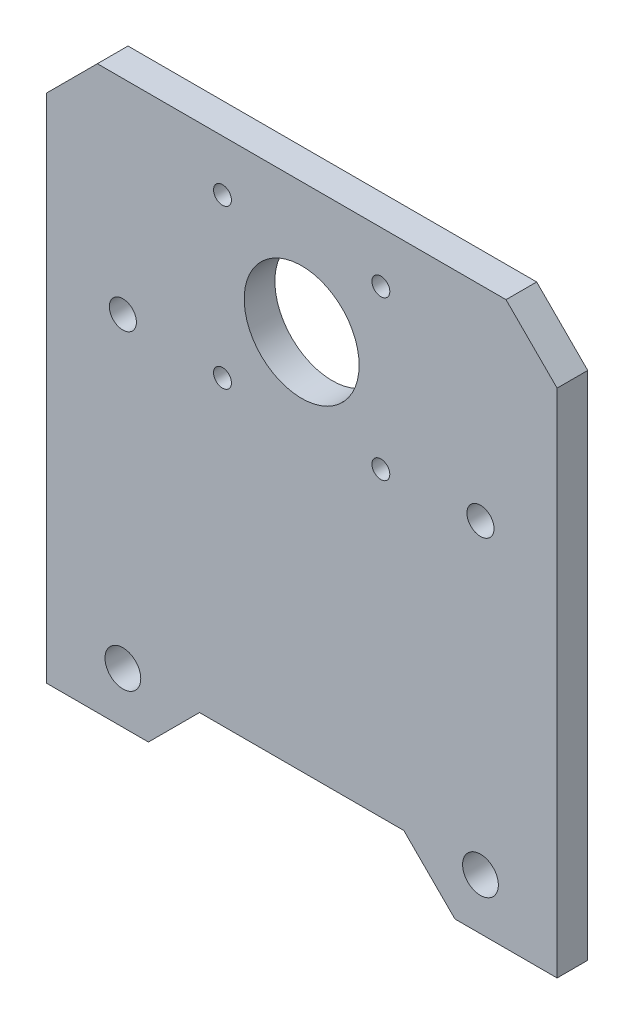
ISO-10303-21;
HEADER;
FILE_DESCRIPTION(('STEP AP214'),'2;1');
FILE_NAME('part.step','',(''),(''),'','','');
FILE_SCHEMA(('AUTOMOTIVE_DESIGN { 1 0 10303 214 1 1 1 1 }'));
ENDSEC;
DATA;
#1=APPLICATION_CONTEXT('core data for automotive mechanical design processes');
#2=APPLICATION_PROTOCOL_DEFINITION('international standard','automotive_design',2000,#1);
#3=PRODUCT_CONTEXT('',#1,'mechanical');
#4=PRODUCT('Part','Part','',(#3));
#5=PRODUCT_RELATED_PRODUCT_CATEGORY('part','',(#4));
#6=PRODUCT_DEFINITION_FORMATION('','',#4);
#7=PRODUCT_DEFINITION_CONTEXT('part definition',#1,'design');
#8=PRODUCT_DEFINITION('design','',#6,#7);
#9=PRODUCT_DEFINITION_SHAPE('','',#8);
#10=(LENGTH_UNIT() NAMED_UNIT(*) SI_UNIT(.MILLI.,.METRE.));
#11=(NAMED_UNIT(*) PLANE_ANGLE_UNIT() SI_UNIT($,.RADIAN.));
#12=(NAMED_UNIT(*) SI_UNIT($,.STERADIAN.) SOLID_ANGLE_UNIT());
#13=UNCERTAINTY_MEASURE_WITH_UNIT(LENGTH_MEASURE(1.E-05),#10,'distance_accuracy_value','');
#14=(GEOMETRIC_REPRESENTATION_CONTEXT(3) GLOBAL_UNCERTAINTY_ASSIGNED_CONTEXT((#13)) GLOBAL_UNIT_ASSIGNED_CONTEXT((#10,
#11,#12)) REPRESENTATION_CONTEXT('',''));
#15=CARTESIAN_POINT('',(0.,0.,0.));
#16=DIRECTION('',(0.,0.,1.));
#17=DIRECTION('',(1.,0.,0.));
#18=AXIS2_PLACEMENT_3D('',#15,#16,#17);
#19=CARTESIAN_POINT('',(0.,0.,6.));
#20=DIRECTION('',(0.,0.,-1.));
#21=DIRECTION('',(-1.,0.,0.));
#22=AXIS2_PLACEMENT_3D('',#19,#20,#21);
#23=PLANE('',#22);
#24=DIRECTION('',(-1.,0.,0.));
#25=VECTOR('',#24,1.);
#26=CARTESIAN_POINT('',(10.,110.,6.));
#27=LINE('',#26,#25);
#28=CARTESIAN_POINT('',(90.,110.,6.));
#29=VERTEX_POINT('',#28);
#30=CARTESIAN_POINT('',(10.,110.,6.));
#31=VERTEX_POINT('',#30);
#32=EDGE_CURVE('E186',#29,#31,#27,.T.);
#33=ORIENTED_EDGE('',*,*,#32,.T.);
#34=DIRECTION('',(-0.707106781186546,-0.707106781186549,0.));
#35=VECTOR('',#34,1.);
#36=CARTESIAN_POINT('',(0.,100.,6.));
#37=LINE('',#36,#35);
#38=CARTESIAN_POINT('',(0.,100.,6.));
#39=VERTEX_POINT('',#38);
#40=EDGE_CURVE('E108',#31,#39,#37,.T.);
#41=ORIENTED_EDGE('',*,*,#40,.T.);
#42=DIRECTION('',(0.,-1.,0.));
#43=VECTOR('',#42,1.);
#44=CARTESIAN_POINT('',(0.,0.,6.));
#45=LINE('',#44,#43);
#46=CARTESIAN_POINT('',(0.,0.,6.));
#47=VERTEX_POINT('',#46);
#48=EDGE_CURVE('E218',#39,#47,#45,.T.);
#49=ORIENTED_EDGE('',*,*,#48,.T.);
#50=DIRECTION('',(1.,0.,0.));
#51=VECTOR('',#50,1.);
#52=CARTESIAN_POINT('',(20.,0.,6.));
#53=LINE('',#52,#51);
#54=CARTESIAN_POINT('',(20.,0.,6.));
#55=VERTEX_POINT('',#54);
#56=EDGE_CURVE('E238',#47,#55,#53,.T.);
#57=ORIENTED_EDGE('',*,*,#56,.T.);
#58=DIRECTION('',(0.707106781186547,0.707106781186548,0.));
#59=VECTOR('',#58,1.);
#60=CARTESIAN_POINT('',(29.9999999999998,9.99999999999976,6.));
#61=LINE('',#60,#59);
#62=CARTESIAN_POINT('',(29.9999999999998,9.99999999999976,6.));
#63=VERTEX_POINT('',#62);
#64=EDGE_CURVE('E234',#55,#63,#61,.T.);
#65=ORIENTED_EDGE('',*,*,#64,.T.);
#66=DIRECTION('',(1.,0.,0.));
#67=VECTOR('',#66,1.);
#68=CARTESIAN_POINT('',(70.0000000000002,9.99999999999976,6.));
#69=LINE('',#68,#67);
#70=CARTESIAN_POINT('',(70.0000000000002,9.99999999999976,6.));
#71=VERTEX_POINT('',#70);
#72=EDGE_CURVE('E237',#63,#71,#69,.T.);
#73=ORIENTED_EDGE('',*,*,#72,.T.);
#74=DIRECTION('',(0.707106781186548,-0.707106781186548,0.));
#75=VECTOR('',#74,1.);
#76=CARTESIAN_POINT('',(80.,0.,6.));
#77=LINE('',#76,#75);
#78=CARTESIAN_POINT('',(80.,0.,6.));
#79=VERTEX_POINT('',#78);
#80=EDGE_CURVE('E133',#71,#79,#77,.T.);
#81=ORIENTED_EDGE('',*,*,#80,.T.);
#82=DIRECTION('',(1.,0.,0.));
#83=VECTOR('',#82,1.);
#84=CARTESIAN_POINT('',(100.,0.,6.));
#85=LINE('',#84,#83);
#86=CARTESIAN_POINT('',(100.,0.,6.));
#87=VERTEX_POINT('',#86);
#88=EDGE_CURVE('E127',#79,#87,#85,.T.);
#89=ORIENTED_EDGE('',*,*,#88,.T.);
#90=DIRECTION('',(0.,1.,0.));
#91=VECTOR('',#90,1.);
#92=CARTESIAN_POINT('',(100.,100.,6.));
#93=LINE('',#92,#91);
#94=CARTESIAN_POINT('',(100.,100.,6.));
#95=VERTEX_POINT('',#94);
#96=EDGE_CURVE('E131',#87,#95,#93,.T.);
#97=ORIENTED_EDGE('',*,*,#96,.T.);
#98=DIRECTION('',(-0.707106781186551,0.707106781186544,0.));
#99=VECTOR('',#98,1.);
#100=CARTESIAN_POINT('',(90.,110.,6.));
#101=LINE('',#100,#99);
#102=EDGE_CURVE('E59',#95,#29,#101,.T.);
#103=ORIENTED_EDGE('',*,*,#102,.T.);
#104=EDGE_LOOP('',(#33,#41,#49,#57,#65,#73,#81,#89,#97,#103));
#105=FACE_BOUND('',#104,.T.);
#106=CARTESIAN_POINT('',(34.5,100.,6.));
#107=DIRECTION('',(0.,0.,1.));
#108=DIRECTION('',(1.,0.,0.));
#109=AXIS2_PLACEMENT_3D('',#106,#107,#108);
#110=CIRCLE('',#109,1.75);
#111=CARTESIAN_POINT('',(36.25,100.,6.));
#112=VERTEX_POINT('',#111);
#113=EDGE_CURVE('E162',#112,#112,#110,.T.);
#114=ORIENTED_EDGE('',*,*,#113,.F.);
#115=EDGE_LOOP('',(#114));
#116=FACE_BOUND('',#115,.T.);
#117=CARTESIAN_POINT('',(65.5,100.,6.));
#118=DIRECTION('',(0.,0.,1.));
#119=DIRECTION('',(1.,0.,0.));
#120=AXIS2_PLACEMENT_3D('',#117,#118,#119);
#121=CIRCLE('',#120,1.75);
#122=CARTESIAN_POINT('',(67.25,100.,6.));
#123=VERTEX_POINT('',#122);
#124=EDGE_CURVE('E269',#123,#123,#121,.T.);
#125=ORIENTED_EDGE('',*,*,#124,.F.);
#126=EDGE_LOOP('',(#125));
#127=FACE_BOUND('',#126,.T.);
#128=CARTESIAN_POINT('',(65.5,69.,6.));
#129=DIRECTION('',(0.,0.,1.));
#130=DIRECTION('',(1.,0.,0.));
#131=AXIS2_PLACEMENT_3D('',#128,#129,#130);
#132=CIRCLE('',#131,1.75);
#133=CARTESIAN_POINT('',(67.25,69.,6.));
#134=VERTEX_POINT('',#133);
#135=EDGE_CURVE('E309',#134,#134,#132,.T.);
#136=ORIENTED_EDGE('',*,*,#135,.F.);
#137=EDGE_LOOP('',(#136));
#138=FACE_BOUND('',#137,.T.);
#139=CARTESIAN_POINT('',(34.5,69.,6.));
#140=DIRECTION('',(0.,0.,1.));
#141=DIRECTION('',(1.,0.,0.));
#142=AXIS2_PLACEMENT_3D('',#139,#140,#141);
#143=CIRCLE('',#142,1.75);
#144=CARTESIAN_POINT('',(36.25,69.,6.));
#145=VERTEX_POINT('',#144);
#146=EDGE_CURVE('E263',#145,#145,#143,.T.);
#147=ORIENTED_EDGE('',*,*,#146,.F.);
#148=EDGE_LOOP('',(#147));
#149=FACE_BOUND('',#148,.T.);
#150=CARTESIAN_POINT('',(50.,84.5,6.));
#151=DIRECTION('',(0.,0.,1.));
#152=DIRECTION('',(1.,0.,0.));
#153=AXIS2_PLACEMENT_3D('',#150,#151,#152);
#154=CIRCLE('',#153,11.25);
#155=CARTESIAN_POINT('',(61.25,84.5,6.));
#156=VERTEX_POINT('',#155);
#157=EDGE_CURVE('E264',#156,#156,#154,.T.);
#158=ORIENTED_EDGE('',*,*,#157,.F.);
#159=EDGE_LOOP('',(#158));
#160=FACE_BOUND('',#159,.T.);
#161=CARTESIAN_POINT('',(85.,70.,6.));
#162=DIRECTION('',(0.,0.,1.));
#163=DIRECTION('',(1.,0.,0.));
#164=AXIS2_PLACEMENT_3D('',#161,#162,#163);
#165=CIRCLE('',#164,2.65);
#166=CARTESIAN_POINT('',(87.65,70.,6.));
#167=VERTEX_POINT('',#166);
#168=EDGE_CURVE('E293',#167,#167,#165,.T.);
#169=ORIENTED_EDGE('',*,*,#168,.F.);
#170=EDGE_LOOP('',(#169));
#171=FACE_BOUND('',#170,.T.);
#172=CARTESIAN_POINT('',(15.,70.,6.));
#173=DIRECTION('',(0.,0.,1.));
#174=DIRECTION('',(1.,0.,0.));
#175=AXIS2_PLACEMENT_3D('',#172,#173,#174);
#176=CIRCLE('',#175,2.65);
#177=CARTESIAN_POINT('',(17.65,70.,6.));
#178=VERTEX_POINT('',#177);
#179=EDGE_CURVE('E252',#178,#178,#176,.T.);
#180=ORIENTED_EDGE('',*,*,#179,.F.);
#181=EDGE_LOOP('',(#180));
#182=FACE_BOUND('',#181,.T.);
#183=CARTESIAN_POINT('',(15.,9.99999999999999,6.));
#184=DIRECTION('',(0.,0.,1.));
#185=DIRECTION('',(1.,0.,0.));
#186=AXIS2_PLACEMENT_3D('',#183,#184,#185);
#187=CIRCLE('',#186,3.5);
#188=CARTESIAN_POINT('',(18.5,9.99999999999999,6.));
#189=VERTEX_POINT('',#188);
#190=EDGE_CURVE('E253',#189,#189,#187,.T.);
#191=ORIENTED_EDGE('',*,*,#190,.F.);
#192=EDGE_LOOP('',(#191));
#193=FACE_BOUND('',#192,.T.);
#194=CARTESIAN_POINT('',(85.,9.99999999999999,6.));
#195=DIRECTION('',(0.,0.,1.));
#196=DIRECTION('',(1.,0.,0.));
#197=AXIS2_PLACEMENT_3D('',#194,#195,#196);
#198=CIRCLE('',#197,3.50000000000001);
#199=CARTESIAN_POINT('',(88.5,9.99999999999999,6.));
#200=VERTEX_POINT('',#199);
#201=EDGE_CURVE('E273',#200,#200,#198,.T.);
#202=ORIENTED_EDGE('',*,*,#201,.F.);
#203=EDGE_LOOP('',(#202));
#204=FACE_BOUND('',#203,.T.);
#205=ADVANCED_FACE('F41',(#105,#116,#127,#138,#149,#160,#171,#182,#193,#204),#23,.F.);
#206=CARTESIAN_POINT('',(0.,0.,0.));
#207=DIRECTION('',(0.,0.,-1.));
#208=DIRECTION('',(-1.,0.,0.));
#209=AXIS2_PLACEMENT_3D('',#206,#207,#208);
#210=PLANE('',#209);
#211=CARTESIAN_POINT('',(15.,9.99999999999999,0.));
#212=DIRECTION('',(0.,0.,1.));
#213=DIRECTION('',(1.,0.,0.));
#214=AXIS2_PLACEMENT_3D('',#211,#212,#213);
#215=CIRCLE('',#214,3.5);
#216=CARTESIAN_POINT('',(18.5,9.99999999999999,0.));
#217=VERTEX_POINT('',#216);
#218=EDGE_CURVE('E275',#217,#217,#215,.T.);
#219=ORIENTED_EDGE('',*,*,#218,.T.);
#220=EDGE_LOOP('',(#219));
#221=FACE_BOUND('',#220,.T.);
#222=CARTESIAN_POINT('',(85.,70.,0.));
#223=DIRECTION('',(0.,0.,1.));
#224=DIRECTION('',(1.,0.,0.));
#225=AXIS2_PLACEMENT_3D('',#222,#223,#224);
#226=CIRCLE('',#225,2.65);
#227=CARTESIAN_POINT('',(87.65,70.,0.));
#228=VERTEX_POINT('',#227);
#229=EDGE_CURVE('E291',#228,#228,#226,.T.);
#230=ORIENTED_EDGE('',*,*,#229,.T.);
#231=EDGE_LOOP('',(#230));
#232=FACE_BOUND('',#231,.T.);
#233=CARTESIAN_POINT('',(34.5,69.,0.));
#234=DIRECTION('',(0.,0.,1.));
#235=DIRECTION('',(1.,0.,0.));
#236=AXIS2_PLACEMENT_3D('',#233,#234,#235);
#237=CIRCLE('',#236,1.75);
#238=CARTESIAN_POINT('',(36.25,69.,0.));
#239=VERTEX_POINT('',#238);
#240=EDGE_CURVE('E260',#239,#239,#237,.T.);
#241=ORIENTED_EDGE('',*,*,#240,.T.);
#242=EDGE_LOOP('',(#241));
#243=FACE_BOUND('',#242,.T.);
#244=CARTESIAN_POINT('',(65.5,100.,0.));
#245=DIRECTION('',(0.,0.,1.));
#246=DIRECTION('',(1.,0.,0.));
#247=AXIS2_PLACEMENT_3D('',#244,#245,#246);
#248=CIRCLE('',#247,1.75);
#249=CARTESIAN_POINT('',(67.25,100.,0.));
#250=VERTEX_POINT('',#249);
#251=EDGE_CURVE('E313',#250,#250,#248,.T.);
#252=ORIENTED_EDGE('',*,*,#251,.T.);
#253=EDGE_LOOP('',(#252));
#254=FACE_BOUND('',#253,.T.);
#255=DIRECTION('',(-1.,0.,0.));
#256=VECTOR('',#255,1.);
#257=CARTESIAN_POINT('',(10.,110.,0.));
#258=LINE('',#257,#256);
#259=CARTESIAN_POINT('',(90.,110.,0.));
#260=VERTEX_POINT('',#259);
#261=CARTESIAN_POINT('',(10.,110.,0.));
#262=VERTEX_POINT('',#261);
#263=EDGE_CURVE('E157',#260,#262,#258,.T.);
#264=ORIENTED_EDGE('',*,*,#263,.F.);
#265=DIRECTION('',(-0.707106781186551,0.707106781186544,0.));
#266=VECTOR('',#265,1.);
#267=CARTESIAN_POINT('',(90.,110.,0.));
#268=LINE('',#267,#266);
#269=CARTESIAN_POINT('',(100.,100.,0.));
#270=VERTEX_POINT('',#269);
#271=EDGE_CURVE('E100',#270,#260,#268,.T.);
#272=ORIENTED_EDGE('',*,*,#271,.F.);
#273=DIRECTION('',(0.,1.,0.));
#274=VECTOR('',#273,1.);
#275=CARTESIAN_POINT('',(100.,100.,0.));
#276=LINE('',#275,#274);
#277=CARTESIAN_POINT('',(100.,0.,0.));
#278=VERTEX_POINT('',#277);
#279=EDGE_CURVE('E94',#278,#270,#276,.T.);
#280=ORIENTED_EDGE('',*,*,#279,.F.);
#281=DIRECTION('',(1.,0.,0.));
#282=VECTOR('',#281,1.);
#283=CARTESIAN_POINT('',(100.,0.,0.));
#284=LINE('',#283,#282);
#285=CARTESIAN_POINT('',(80.,0.,0.));
#286=VERTEX_POINT('',#285);
#287=EDGE_CURVE('E142',#286,#278,#284,.T.);
#288=ORIENTED_EDGE('',*,*,#287,.F.);
#289=DIRECTION('',(0.707106781186548,-0.707106781186548,0.));
#290=VECTOR('',#289,1.);
#291=CARTESIAN_POINT('',(80.,0.,0.));
#292=LINE('',#291,#290);
#293=CARTESIAN_POINT('',(70.0000000000002,9.99999999999976,0.));
#294=VERTEX_POINT('',#293);
#295=EDGE_CURVE('E177',#294,#286,#292,.T.);
#296=ORIENTED_EDGE('',*,*,#295,.F.);
#297=DIRECTION('',(1.,0.,0.));
#298=VECTOR('',#297,1.);
#299=CARTESIAN_POINT('',(70.0000000000002,9.99999999999976,0.));
#300=LINE('',#299,#298);
#301=CARTESIAN_POINT('',(29.9999999999998,9.99999999999976,0.));
#302=VERTEX_POINT('',#301);
#303=EDGE_CURVE('E174',#302,#294,#300,.T.);
#304=ORIENTED_EDGE('',*,*,#303,.F.);
#305=DIRECTION('',(0.707106781186547,0.707106781186548,0.));
#306=VECTOR('',#305,1.);
#307=CARTESIAN_POINT('',(29.9999999999998,9.99999999999976,0.));
#308=LINE('',#307,#306);
#309=CARTESIAN_POINT('',(20.,0.,0.));
#310=VERTEX_POINT('',#309);
#311=EDGE_CURVE('E171',#310,#302,#308,.T.);
#312=ORIENTED_EDGE('',*,*,#311,.F.);
#313=DIRECTION('',(1.,0.,0.));
#314=VECTOR('',#313,1.);
#315=CARTESIAN_POINT('',(20.,0.,0.));
#316=LINE('',#315,#314);
#317=CARTESIAN_POINT('',(0.,0.,0.));
#318=VERTEX_POINT('',#317);
#319=EDGE_CURVE('E168',#318,#310,#316,.T.);
#320=ORIENTED_EDGE('',*,*,#319,.F.);
#321=DIRECTION('',(0.,-1.,0.));
#322=VECTOR('',#321,1.);
#323=CARTESIAN_POINT('',(0.,0.,0.));
#324=LINE('',#323,#322);
#325=CARTESIAN_POINT('',(0.,100.,0.));
#326=VERTEX_POINT('',#325);
#327=EDGE_CURVE('E165',#326,#318,#324,.T.);
#328=ORIENTED_EDGE('',*,*,#327,.F.);
#329=DIRECTION('',(-0.707106781186546,-0.707106781186549,0.));
#330=VECTOR('',#329,1.);
#331=CARTESIAN_POINT('',(0.,100.,0.));
#332=LINE('',#331,#330);
#333=EDGE_CURVE('E161',#262,#326,#332,.T.);
#334=ORIENTED_EDGE('',*,*,#333,.F.);
#335=EDGE_LOOP('',(#264,#272,#280,#288,#296,#304,#312,#320,#328,#334));
#336=FACE_BOUND('',#335,.T.);
#337=CARTESIAN_POINT('',(34.5,100.,0.));
#338=DIRECTION('',(0.,0.,1.));
#339=DIRECTION('',(1.,0.,0.));
#340=AXIS2_PLACEMENT_3D('',#337,#338,#339);
#341=CIRCLE('',#340,1.75);
#342=CARTESIAN_POINT('',(36.25,100.,0.));
#343=VERTEX_POINT('',#342);
#344=EDGE_CURVE('E266',#343,#343,#341,.T.);
#345=ORIENTED_EDGE('',*,*,#344,.T.);
#346=EDGE_LOOP('',(#345));
#347=FACE_BOUND('',#346,.T.);
#348=CARTESIAN_POINT('',(65.5,69.,0.));
#349=DIRECTION('',(0.,0.,1.));
#350=DIRECTION('',(1.,0.,0.));
#351=AXIS2_PLACEMENT_3D('',#348,#349,#350);
#352=CIRCLE('',#351,1.75);
#353=CARTESIAN_POINT('',(67.25,69.,0.));
#354=VERTEX_POINT('',#353);
#355=EDGE_CURVE('E307',#354,#354,#352,.T.);
#356=ORIENTED_EDGE('',*,*,#355,.T.);
#357=EDGE_LOOP('',(#356));
#358=FACE_BOUND('',#357,.T.);
#359=CARTESIAN_POINT('',(50.,84.5,0.));
#360=DIRECTION('',(0.,0.,1.));
#361=DIRECTION('',(1.,0.,0.));
#362=AXIS2_PLACEMENT_3D('',#359,#360,#361);
#363=CIRCLE('',#362,11.25);
#364=CARTESIAN_POINT('',(61.25,84.5,0.));
#365=VERTEX_POINT('',#364);
#366=EDGE_CURVE('E297',#365,#365,#363,.T.);
#367=ORIENTED_EDGE('',*,*,#366,.T.);
#368=EDGE_LOOP('',(#367));
#369=FACE_BOUND('',#368,.T.);
#370=CARTESIAN_POINT('',(15.,70.,0.));
#371=DIRECTION('',(0.,0.,1.));
#372=DIRECTION('',(1.,0.,0.));
#373=AXIS2_PLACEMENT_3D('',#370,#371,#372);
#374=CIRCLE('',#373,2.65);
#375=CARTESIAN_POINT('',(17.65,70.,0.));
#376=VERTEX_POINT('',#375);
#377=EDGE_CURVE('E250',#376,#376,#374,.T.);
#378=ORIENTED_EDGE('',*,*,#377,.T.);
#379=EDGE_LOOP('',(#378));
#380=FACE_BOUND('',#379,.T.);
#381=CARTESIAN_POINT('',(85.,9.99999999999999,0.));
#382=DIRECTION('',(0.,0.,1.));
#383=DIRECTION('',(1.,0.,0.));
#384=AXIS2_PLACEMENT_3D('',#381,#382,#383);
#385=CIRCLE('',#384,3.50000000000001);
#386=CARTESIAN_POINT('',(88.5,9.99999999999999,0.));
#387=VERTEX_POINT('',#386);
#388=EDGE_CURVE('E276',#387,#387,#385,.T.);
#389=ORIENTED_EDGE('',*,*,#388,.T.);
#390=EDGE_LOOP('',(#389));
#391=FACE_BOUND('',#390,.T.);
#392=ADVANCED_FACE('F222',(#221,#232,#243,#254,#336,#347,#358,#369,#380,#391),#210,.T.);
#393=CARTESIAN_POINT('',(10.,110.,6.));
#394=DIRECTION('',(0.,-1.,0.));
#395=DIRECTION('',(0.,0.,-1.));
#396=AXIS2_PLACEMENT_3D('',#393,#394,#395);
#397=PLANE('',#396);
#398=ORIENTED_EDGE('',*,*,#263,.T.);
#399=DIRECTION('',(0.,0.,-1.));
#400=VECTOR('',#399,1.);
#401=CARTESIAN_POINT('',(10.,110.,6.));
#402=LINE('',#401,#400);
#403=EDGE_CURVE('E11',#31,#262,#402,.T.);
#404=ORIENTED_EDGE('',*,*,#403,.F.);
#405=ORIENTED_EDGE('',*,*,#32,.F.);
#406=DIRECTION('',(0.,0.,-1.));
#407=VECTOR('',#406,1.);
#408=CARTESIAN_POINT('',(90.,110.,6.));
#409=LINE('',#408,#407);
#410=EDGE_CURVE('E153',#29,#260,#409,.T.);
#411=ORIENTED_EDGE('',*,*,#410,.T.);
#412=EDGE_LOOP('',(#398,#404,#405,#411));
#413=FACE_BOUND('',#412,.T.);
#414=ADVANCED_FACE('F43',(#413),#397,.F.);
#415=CARTESIAN_POINT('',(0.,100.,6.));
#416=DIRECTION('',(0.707106781186549,-0.707106781186546,0.));
#417=DIRECTION('',(0.707106781186546,0.707106781186549,0.));
#418=AXIS2_PLACEMENT_3D('',#415,#416,#417);
#419=PLANE('',#418);
#420=ORIENTED_EDGE('',*,*,#333,.T.);
#421=DIRECTION('',(0.,0.,-1.));
#422=VECTOR('',#421,1.);
#423=CARTESIAN_POINT('',(0.,100.,6.));
#424=LINE('',#423,#422);
#425=EDGE_CURVE('E51',#39,#326,#424,.T.);
#426=ORIENTED_EDGE('',*,*,#425,.F.);
#427=ORIENTED_EDGE('',*,*,#40,.F.);
#428=ORIENTED_EDGE('',*,*,#403,.T.);
#429=EDGE_LOOP('',(#420,#426,#427,#428));
#430=FACE_BOUND('',#429,.T.);
#431=ADVANCED_FACE('F332',(#430),#419,.F.);
#432=CARTESIAN_POINT('',(0.,0.,6.));
#433=DIRECTION('',(1.,0.,0.));
#434=DIRECTION('',(0.,0.,-1.));
#435=AXIS2_PLACEMENT_3D('',#432,#433,#434);
#436=PLANE('',#435);
#437=ORIENTED_EDGE('',*,*,#327,.T.);
#438=DIRECTION('',(0.,0.,-1.));
#439=VECTOR('',#438,1.);
#440=CARTESIAN_POINT('',(0.,0.,6.));
#441=LINE('',#440,#439);
#442=EDGE_CURVE('E205',#47,#318,#441,.T.);
#443=ORIENTED_EDGE('',*,*,#442,.F.);
#444=ORIENTED_EDGE('',*,*,#48,.F.);
#445=ORIENTED_EDGE('',*,*,#425,.T.);
#446=EDGE_LOOP('',(#437,#443,#444,#445));
#447=FACE_BOUND('',#446,.T.);
#448=ADVANCED_FACE('F216',(#447),#436,.F.);
#449=CARTESIAN_POINT('',(20.,0.,6.));
#450=DIRECTION('',(0.,1.,0.));
#451=DIRECTION('',(0.,0.,1.));
#452=AXIS2_PLACEMENT_3D('',#449,#450,#451);
#453=PLANE('',#452);
#454=ORIENTED_EDGE('',*,*,#319,.T.);
#455=DIRECTION('',(0.,0.,-1.));
#456=VECTOR('',#455,1.);
#457=CARTESIAN_POINT('',(20.,0.,6.));
#458=LINE('',#457,#456);
#459=EDGE_CURVE('E201',#55,#310,#458,.T.);
#460=ORIENTED_EDGE('',*,*,#459,.F.);
#461=ORIENTED_EDGE('',*,*,#56,.F.);
#462=ORIENTED_EDGE('',*,*,#442,.T.);
#463=EDGE_LOOP('',(#454,#460,#461,#462));
#464=FACE_BOUND('',#463,.T.);
#465=ADVANCED_FACE('F228',(#464),#453,.F.);
#466=CARTESIAN_POINT('',(29.9999999999998,9.99999999999976,6.));
#467=DIRECTION('',(-0.707106781186548,0.707106781186547,0.));
#468=DIRECTION('',(-0.707106781186547,-0.707106781186548,0.));
#469=AXIS2_PLACEMENT_3D('',#466,#467,#468);
#470=PLANE('',#469);
#471=ORIENTED_EDGE('',*,*,#311,.T.);
#472=DIRECTION('',(0.,0.,-1.));
#473=VECTOR('',#472,1.);
#474=CARTESIAN_POINT('',(29.9999999999998,9.99999999999976,6.));
#475=LINE('',#474,#473);
#476=EDGE_CURVE('E197',#63,#302,#475,.T.);
#477=ORIENTED_EDGE('',*,*,#476,.F.);
#478=ORIENTED_EDGE('',*,*,#64,.F.);
#479=ORIENTED_EDGE('',*,*,#459,.T.);
#480=EDGE_LOOP('',(#471,#477,#478,#479));
#481=FACE_BOUND('',#480,.T.);
#482=ADVANCED_FACE('F232',(#481),#470,.F.);
#483=CARTESIAN_POINT('',(70.0000000000002,9.99999999999976,6.));
#484=DIRECTION('',(0.,1.,0.));
#485=DIRECTION('',(0.,0.,1.));
#486=AXIS2_PLACEMENT_3D('',#483,#484,#485);
#487=PLANE('',#486);
#488=ORIENTED_EDGE('',*,*,#303,.T.);
#489=DIRECTION('',(0.,0.,-1.));
#490=VECTOR('',#489,1.);
#491=CARTESIAN_POINT('',(70.0000000000002,9.99999999999976,6.));
#492=LINE('',#491,#490);
#493=EDGE_CURVE('E193',#71,#294,#492,.T.);
#494=ORIENTED_EDGE('',*,*,#493,.F.);
#495=ORIENTED_EDGE('',*,*,#72,.F.);
#496=ORIENTED_EDGE('',*,*,#476,.T.);
#497=EDGE_LOOP('',(#488,#494,#495,#496));
#498=FACE_BOUND('',#497,.T.);
#499=ADVANCED_FACE('F360',(#498),#487,.F.);
#500=CARTESIAN_POINT('',(80.,0.,6.));
#501=DIRECTION('',(0.707106781186547,0.707106781186547,0.));
#502=DIRECTION('',(-0.707106781186548,0.707106781186548,0.));
#503=AXIS2_PLACEMENT_3D('',#500,#501,#502);
#504=PLANE('',#503);
#505=ORIENTED_EDGE('',*,*,#295,.T.);
#506=DIRECTION('',(0.,0.,-1.));
#507=VECTOR('',#506,1.);
#508=CARTESIAN_POINT('',(80.,0.,6.));
#509=LINE('',#508,#507);
#510=EDGE_CURVE('E144',#79,#286,#509,.T.);
#511=ORIENTED_EDGE('',*,*,#510,.F.);
#512=ORIENTED_EDGE('',*,*,#80,.F.);
#513=ORIENTED_EDGE('',*,*,#493,.T.);
#514=EDGE_LOOP('',(#505,#511,#512,#513));
#515=FACE_BOUND('',#514,.T.);
#516=ADVANCED_FACE('F357',(#515),#504,.F.);
#517=CARTESIAN_POINT('',(100.,0.,6.));
#518=DIRECTION('',(0.,1.,0.));
#519=DIRECTION('',(0.,0.,1.));
#520=AXIS2_PLACEMENT_3D('',#517,#518,#519);
#521=PLANE('',#520);
#522=ORIENTED_EDGE('',*,*,#287,.T.);
#523=DIRECTION('',(0.,0.,-1.));
#524=VECTOR('',#523,1.);
#525=CARTESIAN_POINT('',(100.,0.,6.));
#526=LINE('',#525,#524);
#527=EDGE_CURVE('E139',#87,#278,#526,.T.);
#528=ORIENTED_EDGE('',*,*,#527,.F.);
#529=ORIENTED_EDGE('',*,*,#88,.F.);
#530=ORIENTED_EDGE('',*,*,#510,.T.);
#531=EDGE_LOOP('',(#522,#528,#529,#530));
#532=FACE_BOUND('',#531,.T.);
#533=ADVANCED_FACE('F140',(#532),#521,.F.);
#534=CARTESIAN_POINT('',(100.,100.,6.));
#535=DIRECTION('',(-1.,0.,0.));
#536=DIRECTION('',(0.,-1.,0.));
#537=AXIS2_PLACEMENT_3D('',#534,#535,#536);
#538=PLANE('',#537);
#539=ORIENTED_EDGE('',*,*,#279,.T.);
#540=DIRECTION('',(0.,0.,-1.));
#541=VECTOR('',#540,1.);
#542=CARTESIAN_POINT('',(100.,100.,6.));
#543=LINE('',#542,#541);
#544=EDGE_CURVE('E145',#95,#270,#543,.T.);
#545=ORIENTED_EDGE('',*,*,#544,.F.);
#546=ORIENTED_EDGE('',*,*,#96,.F.);
#547=ORIENTED_EDGE('',*,*,#527,.T.);
#548=EDGE_LOOP('',(#539,#545,#546,#547));
#549=FACE_BOUND('',#548,.T.);
#550=ADVANCED_FACE('F147',(#549),#538,.F.);
#551=CARTESIAN_POINT('',(90.,110.,6.));
#552=DIRECTION('',(-0.707106781186544,-0.707106781186551,0.));
#553=DIRECTION('',(0.707106781186551,-0.707106781186544,0.));
#554=AXIS2_PLACEMENT_3D('',#551,#552,#553);
#555=PLANE('',#554);
#556=ORIENTED_EDGE('',*,*,#271,.T.);
#557=ORIENTED_EDGE('',*,*,#410,.F.);
#558=ORIENTED_EDGE('',*,*,#102,.F.);
#559=ORIENTED_EDGE('',*,*,#544,.T.);
#560=EDGE_LOOP('',(#556,#557,#558,#559));
#561=FACE_BOUND('',#560,.T.);
#562=ADVANCED_FACE('F350',(#561),#555,.F.);
#563=CARTESIAN_POINT('',(34.5,100.,6.));
#564=DIRECTION('',(0.,0.,-1.));
#565=DIRECTION('',(-1.,0.,0.));
#566=AXIS2_PLACEMENT_3D('',#563,#564,#565);
#567=CYLINDRICAL_SURFACE('',#566,1.75);
#568=ORIENTED_EDGE('',*,*,#113,.T.);
#569=EDGE_LOOP('',(#568));
#570=FACE_BOUND('',#569,.T.);
#571=ORIENTED_EDGE('',*,*,#344,.F.);
#572=EDGE_LOOP('',(#571));
#573=FACE_BOUND('',#572,.T.);
#574=ADVANCED_FACE('F347',(#570,#573),#567,.F.);
#575=CARTESIAN_POINT('',(65.5,100.,6.));
#576=DIRECTION('',(0.,0.,-1.));
#577=DIRECTION('',(-1.,0.,0.));
#578=AXIS2_PLACEMENT_3D('',#575,#576,#577);
#579=CYLINDRICAL_SURFACE('',#578,1.75);
#580=ORIENTED_EDGE('',*,*,#124,.T.);
#581=EDGE_LOOP('',(#580));
#582=FACE_BOUND('',#581,.T.);
#583=ORIENTED_EDGE('',*,*,#251,.F.);
#584=EDGE_LOOP('',(#583));
#585=FACE_BOUND('',#584,.T.);
#586=ADVANCED_FACE('F395',(#582,#585),#579,.F.);
#587=CARTESIAN_POINT('',(65.5,69.,6.));
#588=DIRECTION('',(0.,0.,-1.));
#589=DIRECTION('',(-1.,0.,0.));
#590=AXIS2_PLACEMENT_3D('',#587,#588,#589);
#591=CYLINDRICAL_SURFACE('',#590,1.75);
#592=ORIENTED_EDGE('',*,*,#135,.T.);
#593=EDGE_LOOP('',(#592));
#594=FACE_BOUND('',#593,.T.);
#595=ORIENTED_EDGE('',*,*,#355,.F.);
#596=EDGE_LOOP('',(#595));
#597=FACE_BOUND('',#596,.T.);
#598=ADVANCED_FACE('F401',(#594,#597),#591,.F.);
#599=CARTESIAN_POINT('',(34.5,69.,6.));
#600=DIRECTION('',(0.,0.,-1.));
#601=DIRECTION('',(-1.,0.,0.));
#602=AXIS2_PLACEMENT_3D('',#599,#600,#601);
#603=CYLINDRICAL_SURFACE('',#602,1.75);
#604=ORIENTED_EDGE('',*,*,#146,.T.);
#605=EDGE_LOOP('',(#604));
#606=FACE_BOUND('',#605,.T.);
#607=ORIENTED_EDGE('',*,*,#240,.F.);
#608=EDGE_LOOP('',(#607));
#609=FACE_BOUND('',#608,.T.);
#610=ADVANCED_FACE('F407',(#606,#609),#603,.F.);
#611=CARTESIAN_POINT('',(50.,84.5,6.));
#612=DIRECTION('',(0.,0.,-1.));
#613=DIRECTION('',(-1.,0.,0.));
#614=AXIS2_PLACEMENT_3D('',#611,#612,#613);
#615=CYLINDRICAL_SURFACE('',#614,11.25);
#616=ORIENTED_EDGE('',*,*,#157,.T.);
#617=EDGE_LOOP('',(#616));
#618=FACE_BOUND('',#617,.T.);
#619=ORIENTED_EDGE('',*,*,#366,.F.);
#620=EDGE_LOOP('',(#619));
#621=FACE_BOUND('',#620,.T.);
#622=ADVANCED_FACE('F414',(#618,#621),#615,.F.);
#623=CARTESIAN_POINT('',(85.,70.,6.));
#624=DIRECTION('',(0.,0.,-1.));
#625=DIRECTION('',(-1.,0.,0.));
#626=AXIS2_PLACEMENT_3D('',#623,#624,#625);
#627=CYLINDRICAL_SURFACE('',#626,2.65);
#628=ORIENTED_EDGE('',*,*,#168,.T.);
#629=EDGE_LOOP('',(#628));
#630=FACE_BOUND('',#629,.T.);
#631=ORIENTED_EDGE('',*,*,#229,.F.);
#632=EDGE_LOOP('',(#631));
#633=FACE_BOUND('',#632,.T.);
#634=ADVANCED_FACE('F421',(#630,#633),#627,.F.);
#635=CARTESIAN_POINT('',(15.,70.,6.));
#636=DIRECTION('',(0.,0.,-1.));
#637=DIRECTION('',(-1.,0.,0.));
#638=AXIS2_PLACEMENT_3D('',#635,#636,#637);
#639=CYLINDRICAL_SURFACE('',#638,2.65);
#640=ORIENTED_EDGE('',*,*,#179,.T.);
#641=EDGE_LOOP('',(#640));
#642=FACE_BOUND('',#641,.T.);
#643=ORIENTED_EDGE('',*,*,#377,.F.);
#644=EDGE_LOOP('',(#643));
#645=FACE_BOUND('',#644,.T.);
#646=ADVANCED_FACE('F428',(#642,#645),#639,.F.);
#647=CARTESIAN_POINT('',(15.,9.99999999999999,6.));
#648=DIRECTION('',(0.,0.,-1.));
#649=DIRECTION('',(-1.,0.,0.));
#650=AXIS2_PLACEMENT_3D('',#647,#648,#649);
#651=CYLINDRICAL_SURFACE('',#650,3.5);
#652=ORIENTED_EDGE('',*,*,#190,.T.);
#653=EDGE_LOOP('',(#652));
#654=FACE_BOUND('',#653,.T.);
#655=ORIENTED_EDGE('',*,*,#218,.F.);
#656=EDGE_LOOP('',(#655));
#657=FACE_BOUND('',#656,.T.);
#658=ADVANCED_FACE('F435',(#654,#657),#651,.F.);
#659=CARTESIAN_POINT('',(85.,9.99999999999999,6.));
#660=DIRECTION('',(0.,0.,-1.));
#661=DIRECTION('',(-1.,0.,0.));
#662=AXIS2_PLACEMENT_3D('',#659,#660,#661);
#663=CYLINDRICAL_SURFACE('',#662,3.50000000000001);
#664=ORIENTED_EDGE('',*,*,#201,.T.);
#665=EDGE_LOOP('',(#664));
#666=FACE_BOUND('',#665,.T.);
#667=ORIENTED_EDGE('',*,*,#388,.F.);
#668=EDGE_LOOP('',(#667));
#669=FACE_BOUND('',#668,.T.);
#670=ADVANCED_FACE('F442',(#666,#669),#663,.F.);
#671=CLOSED_SHELL('',(#205,#392,#414,#431,#448,#465,#482,#499,#516,#533,#550,#562,#574,#586,
#598,#610,#622,#634,#646,#658,#670));
#672=MANIFOLD_SOLID_BREP('B2',#671);
#673=ADVANCED_BREP_SHAPE_REPRESENTATION('',(#18,#672),#14);
#674=SHAPE_DEFINITION_REPRESENTATION(#9,#673);
ENDSEC;
END-ISO-10303-21;
